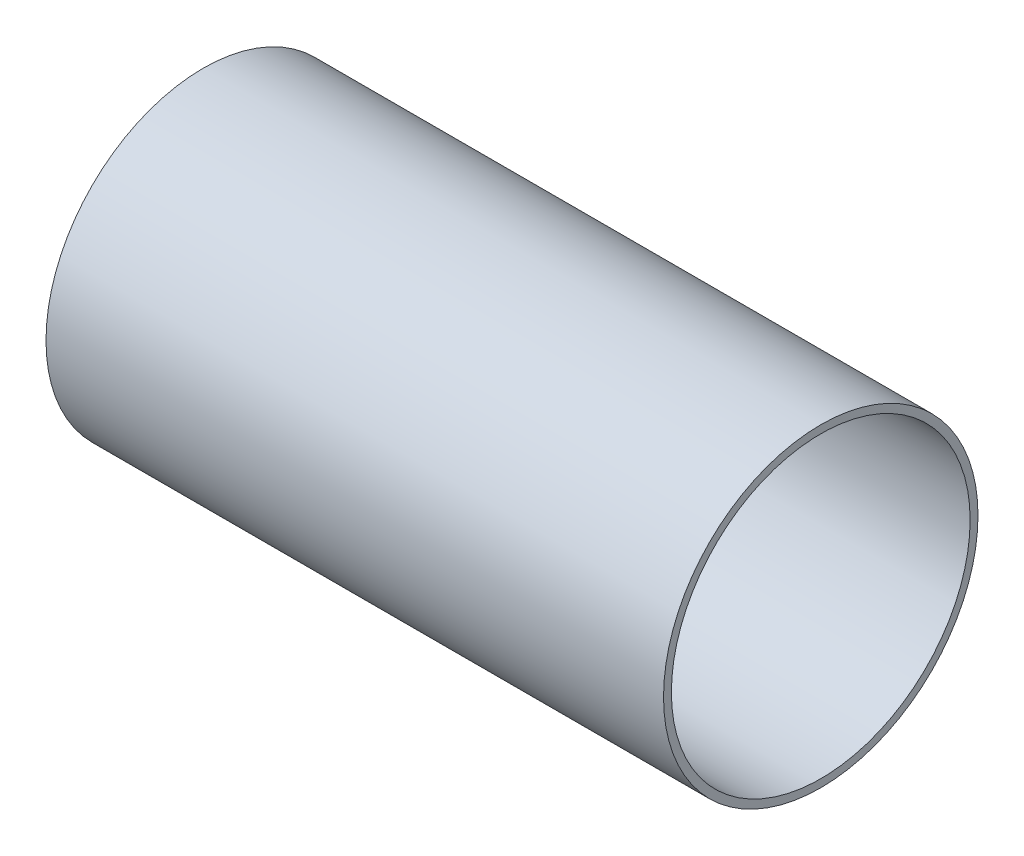
ISO-10303-21;
HEADER;
FILE_DESCRIPTION(('STEP AP214'),'2;1');
FILE_NAME('part.step','',(''),(''),'','','');
FILE_SCHEMA(('AUTOMOTIVE_DESIGN { 1 0 10303 214 1 1 1 1 }'));
ENDSEC;
DATA;
#1=APPLICATION_CONTEXT('core data for automotive mechanical design processes');
#2=APPLICATION_PROTOCOL_DEFINITION('international standard','automotive_design',2000,#1);
#3=PRODUCT_CONTEXT('',#1,'mechanical');
#4=PRODUCT('Part','Part','',(#3));
#5=PRODUCT_RELATED_PRODUCT_CATEGORY('part','',(#4));
#6=PRODUCT_DEFINITION_FORMATION('','',#4);
#7=PRODUCT_DEFINITION_CONTEXT('part definition',#1,'design');
#8=PRODUCT_DEFINITION('design','',#6,#7);
#9=PRODUCT_DEFINITION_SHAPE('','',#8);
#10=(LENGTH_UNIT() NAMED_UNIT(*) SI_UNIT(.MILLI.,.METRE.));
#11=(NAMED_UNIT(*) PLANE_ANGLE_UNIT() SI_UNIT($,.RADIAN.));
#12=(NAMED_UNIT(*) SI_UNIT($,.STERADIAN.) SOLID_ANGLE_UNIT());
#13=UNCERTAINTY_MEASURE_WITH_UNIT(LENGTH_MEASURE(1.E-05),#10,'distance_accuracy_value','');
#14=(GEOMETRIC_REPRESENTATION_CONTEXT(3) GLOBAL_UNCERTAINTY_ASSIGNED_CONTEXT((#13)) GLOBAL_UNIT_ASSIGNED_CONTEXT((#10,
#11,#12)) REPRESENTATION_CONTEXT('',''));
#15=CARTESIAN_POINT('',(0.,0.,0.));
#16=DIRECTION('',(0.,0.,1.));
#17=DIRECTION('',(1.,0.,0.));
#18=AXIS2_PLACEMENT_3D('',#15,#16,#17);
#19=CARTESIAN_POINT('',(41.3,0.,0.));
#20=DIRECTION('',(-1.,0.,0.));
#21=DIRECTION('',(0.,0.,1.));
#22=AXIS2_PLACEMENT_3D('',#19,#20,#21);
#23=PLANE('',#22);
#24=CARTESIAN_POINT('',(41.3,0.,0.));
#25=DIRECTION('',(-1.,0.,0.));
#26=DIRECTION('',(0.,0.,1.));
#27=AXIS2_PLACEMENT_3D('',#24,#25,#26);
#28=CIRCLE('',#27,10.45);
#29=CARTESIAN_POINT('',(41.3,0.,10.45));
#30=VERTEX_POINT('',#29);
#31=EDGE_CURVE('E34',#30,#30,#28,.F.);
#32=ORIENTED_EDGE('',*,*,#31,.T.);
#33=EDGE_LOOP('',(#32));
#34=FACE_BOUND('',#33,.T.);
#35=CARTESIAN_POINT('',(41.3,0.,0.));
#36=DIRECTION('',(1.,0.,0.));
#37=DIRECTION('',(0.,0.,-1.));
#38=AXIS2_PLACEMENT_3D('',#35,#36,#37);
#39=CIRCLE('',#38,4.);
#40=CARTESIAN_POINT('',(41.3,0.,-4.));
#41=VERTEX_POINT('',#40);
#42=EDGE_CURVE('E18',#41,#41,#39,.F.);
#43=ORIENTED_EDGE('',*,*,#42,.T.);
#44=EDGE_LOOP('',(#43));
#45=FACE_BOUND('',#44,.T.);
#46=ADVANCED_FACE('F15',(#34,#45),#23,.F.);
#47=CARTESIAN_POINT('',(49.5,0.,0.));
#48=DIRECTION('',(1.,0.,0.));
#49=DIRECTION('',(0.,0.,-1.));
#50=AXIS2_PLACEMENT_3D('',#47,#48,#49);
#51=CYLINDRICAL_SURFACE('',#50,4.);
#52=CARTESIAN_POINT('',(27.9,0.,0.));
#53=DIRECTION('',(1.,0.,0.));
#54=DIRECTION('',(0.,0.,-1.));
#55=AXIS2_PLACEMENT_3D('',#52,#53,#54);
#56=CIRCLE('',#55,4.);
#57=CARTESIAN_POINT('',(27.9,0.,-4.));
#58=VERTEX_POINT('',#57);
#59=EDGE_CURVE('E32',#58,#58,#56,.T.);
#60=ORIENTED_EDGE('',*,*,#59,.F.);
#61=EDGE_LOOP('',(#60));
#62=FACE_BOUND('',#61,.T.);
#63=ORIENTED_EDGE('',*,*,#42,.F.);
#64=EDGE_LOOP('',(#63));
#65=FACE_BOUND('',#64,.T.);
#66=ADVANCED_FACE('F42',(#62,#65),#51,.F.);
#67=CARTESIAN_POINT('',(56.2,0.,0.));
#68=DIRECTION('',(-1.,0.,0.));
#69=DIRECTION('',(0.,0.,1.));
#70=AXIS2_PLACEMENT_3D('',#67,#68,#69);
#71=CYLINDRICAL_SURFACE('',#70,10.45);
#72=CARTESIAN_POINT('',(71.1,0.,0.));
#73=DIRECTION('',(-1.,0.,0.));
#74=DIRECTION('',(0.,0.,1.));
#75=AXIS2_PLACEMENT_3D('',#72,#73,#74);
#76=CIRCLE('',#75,10.45);
#77=CARTESIAN_POINT('',(71.1,0.,10.45));
#78=VERTEX_POINT('',#77);
#79=EDGE_CURVE('E27',#78,#78,#76,.T.);
#80=ORIENTED_EDGE('',*,*,#79,.F.);
#81=EDGE_LOOP('',(#80));
#82=FACE_BOUND('',#81,.T.);
#83=ORIENTED_EDGE('',*,*,#31,.F.);
#84=EDGE_LOOP('',(#83));
#85=FACE_BOUND('',#84,.T.);
#86=ADVANCED_FACE('F44',(#82,#85),#71,.F.);
#87=CARTESIAN_POINT('',(27.9,0.,7.5));
#88=DIRECTION('',(-1.,0.,0.));
#89=DIRECTION('',(0.,0.,1.));
#90=AXIS2_PLACEMENT_3D('',#87,#88,#89);
#91=PLANE('',#90);
#92=ORIENTED_EDGE('',*,*,#59,.T.);
#93=EDGE_LOOP('',(#92));
#94=FACE_BOUND('',#93,.T.);
#95=CARTESIAN_POINT('',(27.9,0.,0.));
#96=DIRECTION('',(1.,0.,0.));
#97=DIRECTION('',(0.,0.,-1.));
#98=AXIS2_PLACEMENT_3D('',#95,#96,#97);
#99=CIRCLE('',#98,11.);
#100=CARTESIAN_POINT('',(27.9,0.,-11.));
#101=VERTEX_POINT('',#100);
#102=EDGE_CURVE('E22',#101,#101,#99,.T.);
#103=ORIENTED_EDGE('',*,*,#102,.F.);
#104=EDGE_LOOP('',(#103));
#105=FACE_BOUND('',#104,.T.);
#106=ADVANCED_FACE('F51',(#94,#105),#91,.T.);
#107=CARTESIAN_POINT('',(71.1,0.,7.5));
#108=DIRECTION('',(1.,0.,0.));
#109=DIRECTION('',(0.,0.,-1.));
#110=AXIS2_PLACEMENT_3D('',#107,#108,#109);
#111=PLANE('',#110);
#112=CARTESIAN_POINT('',(71.1,0.,0.));
#113=DIRECTION('',(1.,0.,0.));
#114=DIRECTION('',(0.,0.,-1.));
#115=AXIS2_PLACEMENT_3D('',#112,#113,#114);
#116=CIRCLE('',#115,11.);
#117=CARTESIAN_POINT('',(71.1,0.,-11.));
#118=VERTEX_POINT('',#117);
#119=EDGE_CURVE('E10',#118,#118,#116,.F.);
#120=ORIENTED_EDGE('',*,*,#119,.F.);
#121=EDGE_LOOP('',(#120));
#122=FACE_BOUND('',#121,.T.);
#123=ORIENTED_EDGE('',*,*,#79,.T.);
#124=EDGE_LOOP('',(#123));
#125=FACE_BOUND('',#124,.T.);
#126=ADVANCED_FACE('F57',(#122,#125),#111,.T.);
#127=CARTESIAN_POINT('',(49.5,0.,0.));
#128=DIRECTION('',(1.,0.,0.));
#129=DIRECTION('',(0.,0.,-1.));
#130=AXIS2_PLACEMENT_3D('',#127,#128,#129);
#131=CYLINDRICAL_SURFACE('',#130,11.);
#132=ORIENTED_EDGE('',*,*,#102,.T.);
#133=EDGE_LOOP('',(#132));
#134=FACE_BOUND('',#133,.T.);
#135=ORIENTED_EDGE('',*,*,#119,.T.);
#136=EDGE_LOOP('',(#135));
#137=FACE_BOUND('',#136,.T.);
#138=ADVANCED_FACE('F55',(#134,#137),#131,.T.);
#139=CLOSED_SHELL('',(#46,#66,#86,#106,#126,#138));
#140=MANIFOLD_SOLID_BREP('B1',#139);
#141=ADVANCED_BREP_SHAPE_REPRESENTATION('',(#18,#140),#14);
#142=SHAPE_DEFINITION_REPRESENTATION(#9,#141);
ENDSEC;
END-ISO-10303-21;
